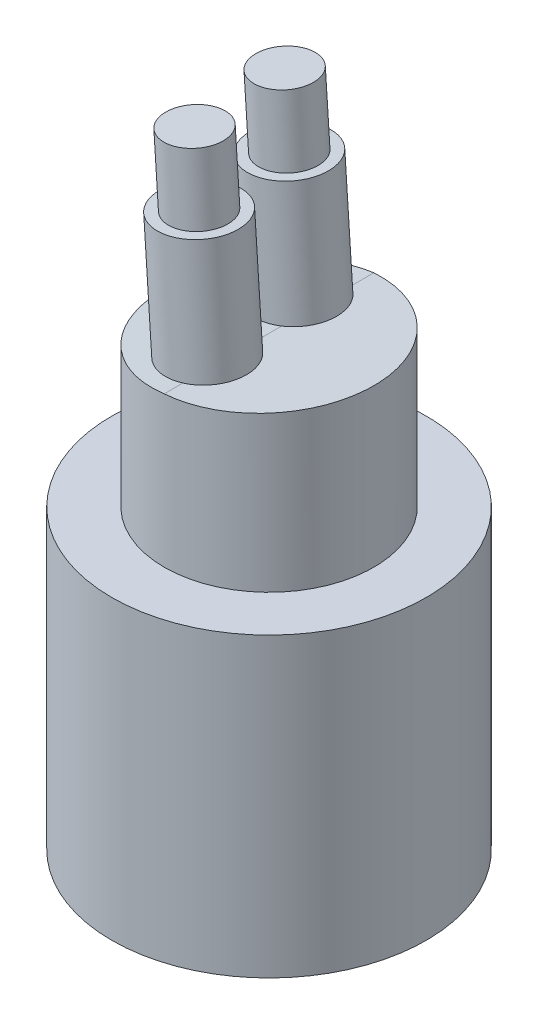
ISO-10303-21;
HEADER;
FILE_DESCRIPTION(('STEP AP214'),'2;1');
FILE_NAME('part.step','',(''),(''),'','','');
FILE_SCHEMA(('AUTOMOTIVE_DESIGN { 1 0 10303 214 1 1 1 1 }'));
ENDSEC;
DATA;
#1=APPLICATION_CONTEXT('core data for automotive mechanical design processes');
#2=APPLICATION_PROTOCOL_DEFINITION('international standard','automotive_design',2000,#1);
#3=PRODUCT_CONTEXT('',#1,'mechanical');
#4=PRODUCT('Part','Part','',(#3));
#5=PRODUCT_RELATED_PRODUCT_CATEGORY('part','',(#4));
#6=PRODUCT_DEFINITION_FORMATION('','',#4);
#7=PRODUCT_DEFINITION_CONTEXT('part definition',#1,'design');
#8=PRODUCT_DEFINITION('design','',#6,#7);
#9=PRODUCT_DEFINITION_SHAPE('','',#8);
#10=(LENGTH_UNIT() NAMED_UNIT(*) SI_UNIT(.MILLI.,.METRE.));
#11=(NAMED_UNIT(*) PLANE_ANGLE_UNIT() SI_UNIT($,.RADIAN.));
#12=(NAMED_UNIT(*) SI_UNIT($,.STERADIAN.) SOLID_ANGLE_UNIT());
#13=UNCERTAINTY_MEASURE_WITH_UNIT(LENGTH_MEASURE(1.E-05),#10,'distance_accuracy_value','');
#14=(GEOMETRIC_REPRESENTATION_CONTEXT(3) GLOBAL_UNCERTAINTY_ASSIGNED_CONTEXT((#13)) GLOBAL_UNIT_ASSIGNED_CONTEXT((#10,
#11,#12)) REPRESENTATION_CONTEXT('',''));
#15=CARTESIAN_POINT('',(0.,0.,0.));
#16=DIRECTION('',(0.,0.,1.));
#17=DIRECTION('',(1.,0.,0.));
#18=AXIS2_PLACEMENT_3D('',#15,#16,#17);
#19=CARTESIAN_POINT('',(0.,17.,0.));
#20=DIRECTION('',(0.,-1.,0.));
#21=DIRECTION('',(0.,0.,-1.));
#22=AXIS2_PLACEMENT_3D('',#19,#20,#21);
#23=CYLINDRICAL_SURFACE('',#22,9.);
#24=CARTESIAN_POINT('',(0.,17.,0.));
#25=DIRECTION('',(0.,1.,0.));
#26=DIRECTION('',(0.,0.,1.));
#27=AXIS2_PLACEMENT_3D('',#24,#25,#26);
#28=CIRCLE('',#27,9.);
#29=CARTESIAN_POINT('',(0.,17.,9.));
#30=VERTEX_POINT('',#29);
#31=EDGE_CURVE('E105',#30,#30,#28,.T.);
#32=ORIENTED_EDGE('',*,*,#31,.F.);
#33=EDGE_LOOP('',(#32));
#34=FACE_BOUND('',#33,.T.);
#35=CARTESIAN_POINT('',(0.,0.,0.));
#36=DIRECTION('',(0.,1.,0.));
#37=DIRECTION('',(0.,0.,1.));
#38=AXIS2_PLACEMENT_3D('',#35,#36,#37);
#39=CIRCLE('',#38,9.);
#40=CARTESIAN_POINT('',(0.,0.,9.));
#41=VERTEX_POINT('',#40);
#42=EDGE_CURVE('E101',#41,#41,#39,.T.);
#43=ORIENTED_EDGE('',*,*,#42,.T.);
#44=EDGE_LOOP('',(#43));
#45=FACE_BOUND('',#44,.T.);
#46=ADVANCED_FACE('F33',(#34,#45),#23,.T.);
#47=CARTESIAN_POINT('',(0.,17.,0.));
#48=DIRECTION('',(0.,1.,0.));
#49=DIRECTION('',(0.,0.,1.));
#50=AXIS2_PLACEMENT_3D('',#47,#48,#49);
#51=PLANE('',#50);
#52=CARTESIAN_POINT('',(0.,17.,0.));
#53=DIRECTION('',(0.,1.,0.));
#54=DIRECTION('',(0.,0.,1.));
#55=AXIS2_PLACEMENT_3D('',#52,#53,#54);
#56=CIRCLE('',#55,6.);
#57=CARTESIAN_POINT('',(0.,17.,6.));
#58=VERTEX_POINT('',#57);
#59=EDGE_CURVE('E102',#58,#58,#56,.T.);
#60=ORIENTED_EDGE('',*,*,#59,.F.);
#61=EDGE_LOOP('',(#60));
#62=FACE_BOUND('',#61,.T.);
#63=ORIENTED_EDGE('',*,*,#31,.T.);
#64=EDGE_LOOP('',(#63));
#65=FACE_BOUND('',#64,.T.);
#66=ADVANCED_FACE('F114',(#62,#65),#51,.T.);
#67=CARTESIAN_POINT('',(0.,0.,0.));
#68=DIRECTION('',(0.,1.,0.));
#69=DIRECTION('',(0.,0.,1.));
#70=AXIS2_PLACEMENT_3D('',#67,#68,#69);
#71=PLANE('',#70);
#72=CARTESIAN_POINT('',(0.,0.,0.));
#73=DIRECTION('',(0.,-1.,0.));
#74=DIRECTION('',(0.,0.,-1.));
#75=AXIS2_PLACEMENT_3D('',#72,#73,#74);
#76=CIRCLE('',#75,2.05);
#77=CARTESIAN_POINT('',(0.,0.,-2.05));
#78=VERTEX_POINT('',#77);
#79=EDGE_CURVE('E286',#78,#78,#76,.T.);
#80=ORIENTED_EDGE('',*,*,#79,.F.);
#81=EDGE_LOOP('',(#80));
#82=FACE_BOUND('',#81,.T.);
#83=ORIENTED_EDGE('',*,*,#42,.F.);
#84=EDGE_LOOP('',(#83));
#85=FACE_BOUND('',#84,.T.);
#86=ADVANCED_FACE('F111',(#82,#85),#71,.F.);
#87=CARTESIAN_POINT('',(0.,26.,0.));
#88=DIRECTION('',(0.,-1.,0.));
#89=DIRECTION('',(0.,0.,-1.));
#90=AXIS2_PLACEMENT_3D('',#87,#88,#89);
#91=CYLINDRICAL_SURFACE('',#90,6.);
#92=CARTESIAN_POINT('',(0.,25.6,0.));
#93=DIRECTION('',(0.132001395797547,-0.991249530394592,0.));
#94=DIRECTION('',(-0.991249530394592,-0.132001395797547,0.));
#95=AXIS2_PLACEMENT_3D('',#92,#93,#94);
#96=ELLIPSE('',#95,6.05296629760979,6.);
#97=CARTESIAN_POINT('',(0.,25.6,6.));
#98=VERTEX_POINT('',#97);
#99=CARTESIAN_POINT('',(0.,25.6,-6.));
#100=VERTEX_POINT('',#99);
#101=EDGE_CURVE('E36',#98,#100,#96,.T.);
#102=ORIENTED_EDGE('',*,*,#101,.T.);
#103=CARTESIAN_POINT('',(0.,25.6,0.));
#104=DIRECTION('',(0.0665190105237741,-0.997785157856609,0.));
#105=DIRECTION('',(-0.997785157856609,-0.0665190105237741,0.));
#106=AXIS2_PLACEMENT_3D('',#103,#104,#105);
#107=ELLIPSE('',#106,6.01331855134916,6.);
#108=EDGE_CURVE('E98',#100,#98,#107,.T.);
#109=ORIENTED_EDGE('',*,*,#108,.T.);
#110=EDGE_LOOP('',(#102,#109));
#111=FACE_BOUND('',#110,.T.);
#112=ORIENTED_EDGE('',*,*,#59,.T.);
#113=EDGE_LOOP('',(#112));
#114=FACE_BOUND('',#113,.T.);
#115=ADVANCED_FACE('F113',(#111,#114),#91,.T.);
#116=CARTESIAN_POINT('',(-6.,24.801,-9.5));
#117=DIRECTION('',(0.132001395797547,-0.991249530394592,0.));
#118=DIRECTION('',(0.991249530394592,0.132001395797547,0.));
#119=AXIS2_PLACEMENT_3D('',#116,#117,#118);
#120=PLANE('',#119);
#121=ORIENTED_EDGE('',*,*,#101,.F.);
#122=DIRECTION('',(0.,0.,1.));
#123=VECTOR('',#122,1.);
#124=CARTESIAN_POINT('',(0.,25.6,-9.5));
#125=LINE('',#124,#123);
#126=CARTESIAN_POINT('',(0.,25.6,4.93318713660352));
#127=VERTEX_POINT('',#126);
#128=EDGE_CURVE('E78',#127,#98,#125,.T.);
#129=ORIENTED_EDGE('',*,*,#128,.F.);
#130=CARTESIAN_POINT('',(0.,25.6,0.67856740628428));
#131=VERTEX_POINT('',#130);
#132=EDGE_CURVE('E72',#131,#127,#125,.T.);
#133=ORIENTED_EDGE('',*,*,#132,.F.);
#134=CARTESIAN_POINT('',(0.,25.6,-0.716549145469365));
#135=VERTEX_POINT('',#134);
#136=EDGE_CURVE('E65',#135,#131,#125,.T.);
#137=ORIENTED_EDGE('',*,*,#136,.F.);
#138=CARTESIAN_POINT('',(0.,25.6,-4.67169631164284));
#139=VERTEX_POINT('',#138);
#140=EDGE_CURVE('E71',#139,#135,#125,.T.);
#141=ORIENTED_EDGE('',*,*,#140,.F.);
#142=EDGE_CURVE('E96',#100,#139,#125,.T.);
#143=ORIENTED_EDGE('',*,*,#142,.F.);
#144=EDGE_LOOP('',(#121,#129,#133,#137,#141,#143));
#145=FACE_BOUND('',#144,.T.);
#146=ADVANCED_FACE('F77',(#145),#120,.F.);
#147=CARTESIAN_POINT('',(0.,25.6,-9.5));
#148=DIRECTION('',(0.0665190105237741,-0.997785157856609,0.));
#149=DIRECTION('',(0.997785157856609,0.0665190105237741,0.));
#150=AXIS2_PLACEMENT_3D('',#147,#148,#149);
#151=PLANE('',#150);
#152=CARTESIAN_POINT('',(-0.731215698715289,25.5512522867523,2.8058772714439));
#153=DIRECTION('',(-0.0665190105237741,0.997785157856609,0.));
#154=DIRECTION('',(-0.997785157856609,-0.0665190105237741,0.));
#155=AXIS2_PLACEMENT_3D('',#152,#153,#154);
#156=CIRCLE('',#155,2.25);
#157=EDGE_CURVE('E49',#127,#131,#156,.T.);
#158=ORIENTED_EDGE('',*,*,#157,.F.);
#159=ORIENTED_EDGE('',*,*,#128,.T.);
#160=ORIENTED_EDGE('',*,*,#108,.F.);
#161=ORIENTED_EDGE('',*,*,#142,.T.);
#162=CARTESIAN_POINT('',(-1.07079722344036,25.5286135184373,-2.6941227285561));
#163=DIRECTION('',(-0.0665190105237741,0.997785157856609,0.));
#164=DIRECTION('',(-0.997785157856609,-0.0665190105237741,0.));
#165=AXIS2_PLACEMENT_3D('',#162,#163,#164);
#166=CIRCLE('',#165,2.25);
#167=EDGE_CURVE('E55',#135,#139,#166,.T.);
#168=ORIENTED_EDGE('',*,*,#167,.F.);
#169=ORIENTED_EDGE('',*,*,#136,.T.);
#170=EDGE_LOOP('',(#158,#159,#160,#161,#168,#169));
#171=FACE_BOUND('',#170,.T.);
#172=ADVANCED_FACE('F67',(#171),#151,.F.);
#173=CARTESIAN_POINT('',(-1.07079722344036,25.5286135184373,-2.6941227285561));
#174=DIRECTION('',(-0.0665190105237741,0.997785157856609,0.));
#175=DIRECTION('',(-0.997785157856609,-0.0665190105237741,0.));
#176=AXIS2_PLACEMENT_3D('',#173,#174,#175);
#177=PLANE('',#176);
#178=EDGE_CURVE('E89',#139,#135,#166,.T.);
#179=ORIENTED_EDGE('',*,*,#178,.F.);
#180=ORIENTED_EDGE('',*,*,#140,.T.);
#181=EDGE_LOOP('',(#179,#180));
#182=FACE_BOUND('',#181,.T.);
#183=ADVANCED_FACE('F159',(#182),#177,.F.);
#184=CARTESIAN_POINT('',(-1.53643029710678,32.5131096234336,-2.6941227285561));
#185=DIRECTION('',(0.0665190105237741,-0.997785157856609,0.));
#186=DIRECTION('',(0.997785157856609,0.0665190105237741,0.));
#187=AXIS2_PLACEMENT_3D('',#184,#185,#186);
#188=CYLINDRICAL_SURFACE('',#187,2.25);
#189=CARTESIAN_POINT('',(-1.53643029710678,32.5131096234336,-2.6941227285561));
#190=DIRECTION('',(-0.0665190105237741,0.997785157856609,0.));
#191=DIRECTION('',(-0.997785157856609,-0.0665190105237741,0.));
#192=AXIS2_PLACEMENT_3D('',#189,#190,#191);
#193=CIRCLE('',#192,2.25);
#194=CARTESIAN_POINT('',(-3.78144690228415,32.3634418497551,-2.6941227285561));
#195=VERTEX_POINT('',#194);
#196=EDGE_CURVE('E93',#195,#195,#193,.T.);
#197=ORIENTED_EDGE('',*,*,#196,.F.);
#198=EDGE_LOOP('',(#197));
#199=FACE_BOUND('',#198,.T.);
#200=ORIENTED_EDGE('',*,*,#167,.T.);
#201=ORIENTED_EDGE('',*,*,#178,.T.);
#202=EDGE_LOOP('',(#200,#201));
#203=FACE_BOUND('',#202,.T.);
#204=ADVANCED_FACE('F168',(#199,#203),#188,.T.);
#205=CARTESIAN_POINT('',(-1.53643029710678,32.5131096234336,-2.6941227285561));
#206=DIRECTION('',(-0.0665190105237741,0.997785157856609,0.));
#207=DIRECTION('',(-0.997785157856609,-0.0665190105237741,0.));
#208=AXIS2_PLACEMENT_3D('',#205,#206,#207);
#209=PLANE('',#208);
#210=CARTESIAN_POINT('',(-1.53643029710678,32.5131096234336,-2.6941227285561));
#211=DIRECTION('',(-0.0665190105237741,0.997785157856609,0.));
#212=DIRECTION('',(-0.997785157856609,-0.0665190105237741,0.));
#213=AXIS2_PLACEMENT_3D('',#210,#211,#212);
#214=CIRCLE('',#213,1.65);
#215=CARTESIAN_POINT('',(-3.18277580757019,32.4033532560694,-2.6941227285561));
#216=VERTEX_POINT('',#215);
#217=EDGE_CURVE('E41',#216,#216,#214,.T.);
#218=ORIENTED_EDGE('',*,*,#217,.F.);
#219=EDGE_LOOP('',(#218));
#220=FACE_BOUND('',#219,.T.);
#221=ORIENTED_EDGE('',*,*,#196,.T.);
#222=EDGE_LOOP('',(#221));
#223=FACE_BOUND('',#222,.T.);
#224=ADVANCED_FACE('F178',(#220,#223),#209,.T.);
#225=CARTESIAN_POINT('',(-0.731215698715289,25.5512522867523,2.8058772714439));
#226=DIRECTION('',(-0.0665190105237741,0.997785157856609,0.));
#227=DIRECTION('',(-0.997785157856609,-0.0665190105237741,0.));
#228=AXIS2_PLACEMENT_3D('',#225,#226,#227);
#229=PLANE('',#228);
#230=EDGE_CURVE('E81',#131,#127,#156,.T.);
#231=ORIENTED_EDGE('',*,*,#230,.F.);
#232=ORIENTED_EDGE('',*,*,#132,.T.);
#233=EDGE_LOOP('',(#231,#232));
#234=FACE_BOUND('',#233,.T.);
#235=ADVANCED_FACE('F82',(#234),#229,.F.);
#236=CARTESIAN_POINT('',(-1.19684877238171,32.5357483917486,2.8058772714439));
#237=DIRECTION('',(0.0665190105237741,-0.997785157856609,0.));
#238=DIRECTION('',(0.997785157856609,0.0665190105237741,0.));
#239=AXIS2_PLACEMENT_3D('',#236,#237,#238);
#240=CYLINDRICAL_SURFACE('',#239,2.25);
#241=CARTESIAN_POINT('',(-1.19684877238171,32.5357483917486,2.8058772714439));
#242=DIRECTION('',(-0.0665190105237741,0.997785157856609,0.));
#243=DIRECTION('',(-0.997785157856609,-0.0665190105237741,0.));
#244=AXIS2_PLACEMENT_3D('',#241,#242,#243);
#245=CIRCLE('',#244,2.25);
#246=CARTESIAN_POINT('',(-3.44186537755908,32.3860806180701,2.8058772714439));
#247=VERTEX_POINT('',#246);
#248=EDGE_CURVE('E87',#247,#247,#245,.T.);
#249=ORIENTED_EDGE('',*,*,#248,.F.);
#250=EDGE_LOOP('',(#249));
#251=FACE_BOUND('',#250,.T.);
#252=ORIENTED_EDGE('',*,*,#157,.T.);
#253=ORIENTED_EDGE('',*,*,#230,.T.);
#254=EDGE_LOOP('',(#252,#253));
#255=FACE_BOUND('',#254,.T.);
#256=ADVANCED_FACE('F86',(#251,#255),#240,.T.);
#257=CARTESIAN_POINT('',(-1.19684877238171,32.5357483917486,2.8058772714439));
#258=DIRECTION('',(-0.0665190105237741,0.997785157856609,0.));
#259=DIRECTION('',(-0.997785157856609,-0.0665190105237741,0.));
#260=AXIS2_PLACEMENT_3D('',#257,#258,#259);
#261=PLANE('',#260);
#262=CARTESIAN_POINT('',(-1.19684877238171,32.5357483917486,2.8058772714439));
#263=DIRECTION('',(-0.0665190105237741,0.997785157856609,0.));
#264=DIRECTION('',(-0.997785157856609,-0.0665190105237741,0.));
#265=AXIS2_PLACEMENT_3D('',#262,#263,#264);
#266=CIRCLE('',#265,1.65);
#267=CARTESIAN_POINT('',(-2.84319428284511,32.4259920243844,2.8058772714439));
#268=VERTEX_POINT('',#267);
#269=EDGE_CURVE('E11',#268,#268,#266,.T.);
#270=ORIENTED_EDGE('',*,*,#269,.F.);
#271=EDGE_LOOP('',(#270));
#272=FACE_BOUND('',#271,.T.);
#273=ORIENTED_EDGE('',*,*,#248,.T.);
#274=EDGE_LOOP('',(#273));
#275=FACE_BOUND('',#274,.T.);
#276=ADVANCED_FACE('F198',(#272,#275),#261,.T.);
#277=CARTESIAN_POINT('',(-1.80250633920188,36.50425025486,-2.6941227285561));
#278=DIRECTION('',(0.0665190105237741,-0.997785157856609,0.));
#279=DIRECTION('',(0.997785157856609,0.0665190105237741,0.));
#280=AXIS2_PLACEMENT_3D('',#277,#278,#279);
#281=CYLINDRICAL_SURFACE('',#280,1.65);
#282=CARTESIAN_POINT('',(-1.80250633920188,36.50425025486,-2.6941227285561));
#283=DIRECTION('',(-0.0665190105237741,0.997785157856609,0.));
#284=DIRECTION('',(-0.997785157856609,-0.0665190105237741,0.));
#285=AXIS2_PLACEMENT_3D('',#282,#283,#284);
#286=CIRCLE('',#285,1.65);
#287=CARTESIAN_POINT('',(-3.44885184966528,36.3944938874958,-2.6941227285561));
#288=VERTEX_POINT('',#287);
#289=EDGE_CURVE('E84',#288,#288,#286,.T.);
#290=ORIENTED_EDGE('',*,*,#289,.F.);
#291=EDGE_LOOP('',(#290));
#292=FACE_BOUND('',#291,.T.);
#293=ORIENTED_EDGE('',*,*,#217,.T.);
#294=EDGE_LOOP('',(#293));
#295=FACE_BOUND('',#294,.T.);
#296=ADVANCED_FACE('F215',(#292,#295),#281,.T.);
#297=CARTESIAN_POINT('',(-1.80250633920188,36.50425025486,-2.6941227285561));
#298=DIRECTION('',(-0.0665190105237741,0.997785157856609,0.));
#299=DIRECTION('',(-0.997785157856609,-0.0665190105237741,0.));
#300=AXIS2_PLACEMENT_3D('',#297,#298,#299);
#301=PLANE('',#300);
#302=ORIENTED_EDGE('',*,*,#289,.T.);
#303=EDGE_LOOP('',(#302));
#304=FACE_BOUND('',#303,.T.);
#305=ADVANCED_FACE('F225',(#304),#301,.T.);
#306=CARTESIAN_POINT('',(-1.46292481447681,36.526889023175,2.8058772714439));
#307=DIRECTION('',(0.0665190105237741,-0.997785157856609,0.));
#308=DIRECTION('',(0.997785157856609,0.0665190105237741,0.));
#309=AXIS2_PLACEMENT_3D('',#306,#307,#308);
#310=CYLINDRICAL_SURFACE('',#309,1.65);
#311=CARTESIAN_POINT('',(-1.46292481447681,36.526889023175,2.8058772714439));
#312=DIRECTION('',(-0.0665190105237741,0.997785157856609,0.));
#313=DIRECTION('',(-0.997785157856609,-0.0665190105237741,0.));
#314=AXIS2_PLACEMENT_3D('',#311,#312,#313);
#315=CIRCLE('',#314,1.65);
#316=CARTESIAN_POINT('',(-3.10927032494021,36.4171326558108,2.8058772714439));
#317=VERTEX_POINT('',#316);
#318=EDGE_CURVE('E285',#317,#317,#315,.T.);
#319=ORIENTED_EDGE('',*,*,#318,.F.);
#320=EDGE_LOOP('',(#319));
#321=FACE_BOUND('',#320,.T.);
#322=ORIENTED_EDGE('',*,*,#269,.T.);
#323=EDGE_LOOP('',(#322));
#324=FACE_BOUND('',#323,.T.);
#325=ADVANCED_FACE('F235',(#321,#324),#310,.T.);
#326=CARTESIAN_POINT('',(-1.46292481447681,36.526889023175,2.8058772714439));
#327=DIRECTION('',(-0.0665190105237741,0.997785157856609,0.));
#328=DIRECTION('',(-0.997785157856609,-0.0665190105237741,0.));
#329=AXIS2_PLACEMENT_3D('',#326,#327,#328);
#330=PLANE('',#329);
#331=ORIENTED_EDGE('',*,*,#318,.T.);
#332=EDGE_LOOP('',(#331));
#333=FACE_BOUND('',#332,.T.);
#334=ADVANCED_FACE('F245',(#333),#330,.T.);
#335=CARTESIAN_POINT('',(0.,5.,0.));
#336=DIRECTION('',(0.,-1.,0.));
#337=DIRECTION('',(0.,0.,-1.));
#338=AXIS2_PLACEMENT_3D('',#335,#336,#337);
#339=CYLINDRICAL_SURFACE('',#338,2.05);
#340=CARTESIAN_POINT('',(0.,5.,0.));
#341=DIRECTION('',(0.,-1.,0.));
#342=DIRECTION('',(0.,0.,-1.));
#343=AXIS2_PLACEMENT_3D('',#340,#341,#342);
#344=CIRCLE('',#343,2.05);
#345=CARTESIAN_POINT('',(0.,5.,-2.05));
#346=VERTEX_POINT('',#345);
#347=EDGE_CURVE('E284',#346,#346,#344,.T.);
#348=ORIENTED_EDGE('',*,*,#347,.F.);
#349=EDGE_LOOP('',(#348));
#350=FACE_BOUND('',#349,.T.);
#351=ORIENTED_EDGE('',*,*,#79,.T.);
#352=EDGE_LOOP('',(#351));
#353=FACE_BOUND('',#352,.T.);
#354=ADVANCED_FACE('F254',(#350,#353),#339,.F.);
#355=CARTESIAN_POINT('',(0.,5.,0.));
#356=DIRECTION('',(0.,-1.,0.));
#357=DIRECTION('',(0.,0.,-1.));
#358=AXIS2_PLACEMENT_3D('',#355,#356,#357);
#359=PLANE('',#358);
#360=ORIENTED_EDGE('',*,*,#347,.T.);
#361=EDGE_LOOP('',(#360));
#362=FACE_BOUND('',#361,.T.);
#363=ADVANCED_FACE('F268',(#362),#359,.T.);
#364=CLOSED_SHELL('',(#46,#66,#86,#115,#146,#172,#183,#204,#224,#235,#256,#276,#296,#305,#325,
#334,#354,#363));
#365=MANIFOLD_SOLID_BREP('B2',#364);
#366=ADVANCED_BREP_SHAPE_REPRESENTATION('',(#18,#365),#14);
#367=SHAPE_DEFINITION_REPRESENTATION(#9,#366);
ENDSEC;
END-ISO-10303-21;
